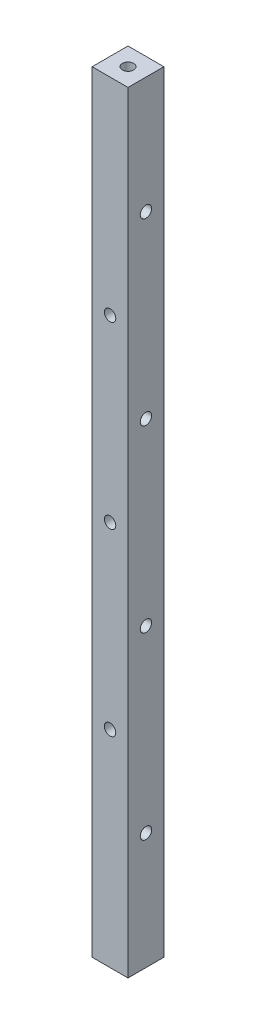
ISO-10303-21;
HEADER;
FILE_DESCRIPTION(('STEP AP214'),'2;1');
FILE_NAME('part.step','',(''),(''),'','','');
FILE_SCHEMA(('AUTOMOTIVE_DESIGN { 1 0 10303 214 1 1 1 1 }'));
ENDSEC;
DATA;
#1=APPLICATION_CONTEXT('core data for automotive mechanical design processes');
#2=APPLICATION_PROTOCOL_DEFINITION('international standard','automotive_design',2000,#1);
#3=PRODUCT_CONTEXT('',#1,'mechanical');
#4=PRODUCT('Part','Part','',(#3));
#5=PRODUCT_RELATED_PRODUCT_CATEGORY('part','',(#4));
#6=PRODUCT_DEFINITION_FORMATION('','',#4);
#7=PRODUCT_DEFINITION_CONTEXT('part definition',#1,'design');
#8=PRODUCT_DEFINITION('design','',#6,#7);
#9=PRODUCT_DEFINITION_SHAPE('','',#8);
#10=(LENGTH_UNIT() NAMED_UNIT(*) SI_UNIT(.MILLI.,.METRE.));
#11=(NAMED_UNIT(*) PLANE_ANGLE_UNIT() SI_UNIT($,.RADIAN.));
#12=(NAMED_UNIT(*) SI_UNIT($,.STERADIAN.) SOLID_ANGLE_UNIT());
#13=UNCERTAINTY_MEASURE_WITH_UNIT(LENGTH_MEASURE(1.E-05),#10,'distance_accuracy_value','');
#14=(GEOMETRIC_REPRESENTATION_CONTEXT(3) GLOBAL_UNCERTAINTY_ASSIGNED_CONTEXT((#13)) GLOBAL_UNIT_ASSIGNED_CONTEXT((#10,
#11,#12)) REPRESENTATION_CONTEXT('',''));
#15=CARTESIAN_POINT('',(0.,0.,0.));
#16=DIRECTION('',(0.,0.,1.));
#17=DIRECTION('',(1.,0.,0.));
#18=AXIS2_PLACEMENT_3D('',#15,#16,#17);
#19=CARTESIAN_POINT('',(-6.34999999999997,136.525,6.35000000000002));
#20=DIRECTION('',(1.,0.,0.));
#21=DIRECTION('',(0.,0.,-1.));
#22=AXIS2_PLACEMENT_3D('',#19,#20,#21);
#23=PLANE('',#22);
#24=CARTESIAN_POINT('',(-6.34999999999997,31.75,0.));
#25=DIRECTION('',(-1.,0.,0.));
#26=DIRECTION('',(0.,0.,1.));
#27=AXIS2_PLACEMENT_3D('',#24,#25,#26);
#28=CIRCLE('',#27,2.01929999999999);
#29=CARTESIAN_POINT('',(-6.34999999999997,31.75,2.01929999999999));
#30=VERTEX_POINT('',#29);
#31=EDGE_CURVE('E190',#30,#30,#28,.T.);
#32=ORIENTED_EDGE('',*,*,#31,.F.);
#33=EDGE_LOOP('',(#32));
#34=FACE_BOUND('',#33,.T.);
#35=CARTESIAN_POINT('',(-6.34999999999997,-31.75,0.));
#36=DIRECTION('',(-1.,0.,0.));
#37=DIRECTION('',(0.,0.,1.));
#38=AXIS2_PLACEMENT_3D('',#35,#36,#37);
#39=CIRCLE('',#38,2.01929999999999);
#40=CARTESIAN_POINT('',(-6.34999999999997,-31.75,2.01929999999999));
#41=VERTEX_POINT('',#40);
#42=EDGE_CURVE('E194',#41,#41,#39,.T.);
#43=ORIENTED_EDGE('',*,*,#42,.F.);
#44=EDGE_LOOP('',(#43));
#45=FACE_BOUND('',#44,.T.);
#46=CARTESIAN_POINT('',(-6.34999999999997,-95.25,0.));
#47=DIRECTION('',(-1.,0.,0.));
#48=DIRECTION('',(0.,0.,1.));
#49=AXIS2_PLACEMENT_3D('',#46,#47,#48);
#50=CIRCLE('',#49,2.01929999999999);
#51=CARTESIAN_POINT('',(-6.34999999999997,-95.25,2.01929999999999));
#52=VERTEX_POINT('',#51);
#53=EDGE_CURVE('E197',#52,#52,#50,.T.);
#54=ORIENTED_EDGE('',*,*,#53,.F.);
#55=EDGE_LOOP('',(#54));
#56=FACE_BOUND('',#55,.T.);
#57=DIRECTION('',(0.,0.,1.));
#58=VECTOR('',#57,1.);
#59=CARTESIAN_POINT('',(-6.34999999999997,-136.525,6.35000000000002));
#60=LINE('',#59,#58);
#61=CARTESIAN_POINT('',(-6.34999999999997,-136.525,-6.35000000000002));
#62=VERTEX_POINT('',#61);
#63=CARTESIAN_POINT('',(-6.34999999999997,-136.525,6.35000000000002));
#64=VERTEX_POINT('',#63);
#65=EDGE_CURVE('E80',#62,#64,#60,.T.);
#66=ORIENTED_EDGE('',*,*,#65,.T.);
#67=DIRECTION('',(0.,-1.,0.));
#68=VECTOR('',#67,1.);
#69=CARTESIAN_POINT('',(-6.34999999999997,136.525,6.35000000000002));
#70=LINE('',#69,#68);
#71=CARTESIAN_POINT('',(-6.34999999999997,136.525,6.35000000000002));
#72=VERTEX_POINT('',#71);
#73=EDGE_CURVE('E152',#72,#64,#70,.T.);
#74=ORIENTED_EDGE('',*,*,#73,.F.);
#75=DIRECTION('',(0.,0.,1.));
#76=VECTOR('',#75,1.);
#77=CARTESIAN_POINT('',(-6.34999999999997,136.525,6.35000000000002));
#78=LINE('',#77,#76);
#79=CARTESIAN_POINT('',(-6.34999999999997,136.525,-6.35000000000002));
#80=VERTEX_POINT('',#79);
#81=EDGE_CURVE('E134',#80,#72,#78,.T.);
#82=ORIENTED_EDGE('',*,*,#81,.F.);
#83=DIRECTION('',(0.,-1.,0.));
#84=VECTOR('',#83,1.);
#85=CARTESIAN_POINT('',(-6.34999999999997,136.525,-6.35000000000002));
#86=LINE('',#85,#84);
#87=EDGE_CURVE('E54',#80,#62,#86,.T.);
#88=ORIENTED_EDGE('',*,*,#87,.T.);
#89=EDGE_LOOP('',(#66,#74,#82,#88));
#90=FACE_BOUND('',#89,.T.);
#91=CARTESIAN_POINT('',(-6.34999999999997,95.25,0.));
#92=DIRECTION('',(-1.,0.,0.));
#93=DIRECTION('',(0.,0.,1.));
#94=AXIS2_PLACEMENT_3D('',#91,#92,#93);
#95=CIRCLE('',#94,2.01929999999999);
#96=CARTESIAN_POINT('',(-6.34999999999997,95.25,2.01929999999999));
#97=VERTEX_POINT('',#96);
#98=EDGE_CURVE('E502',#97,#97,#95,.T.);
#99=ORIENTED_EDGE('',*,*,#98,.F.);
#100=EDGE_LOOP('',(#99));
#101=FACE_BOUND('',#100,.T.);
#102=ADVANCED_FACE('F44',(#34,#45,#56,#90,#101),#23,.F.);
#103=CARTESIAN_POINT('',(6.34999999999997,136.525,6.35000000000002));
#104=DIRECTION('',(-1.,0.,0.));
#105=DIRECTION('',(0.,0.,1.));
#106=AXIS2_PLACEMENT_3D('',#103,#104,#105);
#107=PLANE('',#106);
#108=CARTESIAN_POINT('',(6.34999999999997,95.25,0.));
#109=DIRECTION('',(-1.,0.,0.));
#110=DIRECTION('',(0.,0.,1.));
#111=AXIS2_PLACEMENT_3D('',#108,#109,#110);
#112=CIRCLE('',#111,2.01929999999999);
#113=CARTESIAN_POINT('',(6.34999999999997,95.25,2.01929999999999));
#114=VERTEX_POINT('',#113);
#115=EDGE_CURVE('E498',#114,#114,#112,.T.);
#116=ORIENTED_EDGE('',*,*,#115,.T.);
#117=EDGE_LOOP('',(#116));
#118=FACE_BOUND('',#117,.T.);
#119=CARTESIAN_POINT('',(6.34999999999997,31.75,0.));
#120=DIRECTION('',(-1.,0.,0.));
#121=DIRECTION('',(0.,0.,1.));
#122=AXIS2_PLACEMENT_3D('',#119,#120,#121);
#123=CIRCLE('',#122,2.01929999999999);
#124=CARTESIAN_POINT('',(6.34999999999997,31.75,2.01929999999999));
#125=VERTEX_POINT('',#124);
#126=EDGE_CURVE('E490',#125,#125,#123,.T.);
#127=ORIENTED_EDGE('',*,*,#126,.T.);
#128=EDGE_LOOP('',(#127));
#129=FACE_BOUND('',#128,.T.);
#130=CARTESIAN_POINT('',(6.34999999999997,-31.75,0.));
#131=DIRECTION('',(-1.,0.,0.));
#132=DIRECTION('',(0.,0.,1.));
#133=AXIS2_PLACEMENT_3D('',#130,#131,#132);
#134=CIRCLE('',#133,2.01929999999999);
#135=CARTESIAN_POINT('',(6.34999999999997,-31.75,2.01929999999999));
#136=VERTEX_POINT('',#135);
#137=EDGE_CURVE('E201',#136,#136,#134,.T.);
#138=ORIENTED_EDGE('',*,*,#137,.T.);
#139=EDGE_LOOP('',(#138));
#140=FACE_BOUND('',#139,.T.);
#141=CARTESIAN_POINT('',(6.34999999999997,-95.25,0.));
#142=DIRECTION('',(-1.,0.,0.));
#143=DIRECTION('',(0.,0.,1.));
#144=AXIS2_PLACEMENT_3D('',#141,#142,#143);
#145=CIRCLE('',#144,2.01929999999999);
#146=CARTESIAN_POINT('',(6.34999999999997,-95.25,2.01929999999999));
#147=VERTEX_POINT('',#146);
#148=EDGE_CURVE('E200',#147,#147,#145,.T.);
#149=ORIENTED_EDGE('',*,*,#148,.T.);
#150=EDGE_LOOP('',(#149));
#151=FACE_BOUND('',#150,.T.);
#152=DIRECTION('',(0.,0.,-1.));
#153=VECTOR('',#152,1.);
#154=CARTESIAN_POINT('',(6.34999999999997,-136.525,6.35000000000002));
#155=LINE('',#154,#153);
#156=CARTESIAN_POINT('',(6.34999999999997,-136.525,6.35000000000002));
#157=VERTEX_POINT('',#156);
#158=CARTESIAN_POINT('',(6.34999999999997,-136.525,-6.35000000000002));
#159=VERTEX_POINT('',#158);
#160=EDGE_CURVE('E128',#157,#159,#155,.T.);
#161=ORIENTED_EDGE('',*,*,#160,.T.);
#162=DIRECTION('',(0.,-1.,0.));
#163=VECTOR('',#162,1.);
#164=CARTESIAN_POINT('',(6.34999999999997,136.525,-6.35000000000002));
#165=LINE('',#164,#163);
#166=CARTESIAN_POINT('',(6.34999999999997,136.525,-6.35000000000002));
#167=VERTEX_POINT('',#166);
#168=EDGE_CURVE('E11',#167,#159,#165,.T.);
#169=ORIENTED_EDGE('',*,*,#168,.F.);
#170=DIRECTION('',(0.,0.,-1.));
#171=VECTOR('',#170,1.);
#172=CARTESIAN_POINT('',(6.34999999999997,136.525,6.35000000000002));
#173=LINE('',#172,#171);
#174=CARTESIAN_POINT('',(6.34999999999997,136.525,6.35000000000002));
#175=VERTEX_POINT('',#174);
#176=EDGE_CURVE('E129',#175,#167,#173,.T.);
#177=ORIENTED_EDGE('',*,*,#176,.F.);
#178=DIRECTION('',(0.,-1.,0.));
#179=VECTOR('',#178,1.);
#180=CARTESIAN_POINT('',(6.34999999999997,136.525,6.35000000000002));
#181=LINE('',#180,#179);
#182=EDGE_CURVE('E139',#175,#157,#181,.T.);
#183=ORIENTED_EDGE('',*,*,#182,.T.);
#184=EDGE_LOOP('',(#161,#169,#177,#183));
#185=FACE_BOUND('',#184,.T.);
#186=ADVANCED_FACE('F46',(#118,#129,#140,#151,#185),#107,.F.);
#187=CARTESIAN_POINT('',(-6.34999999999997,136.525,-6.35000000000002));
#188=DIRECTION('',(0.,0.,1.));
#189=DIRECTION('',(1.,0.,0.));
#190=AXIS2_PLACEMENT_3D('',#187,#188,#189);
#191=PLANE('',#190);
#192=CARTESIAN_POINT('',(0.,63.5,-6.35000000000002));
#193=DIRECTION('',(0.,0.,-1.));
#194=DIRECTION('',(-1.,0.,0.));
#195=AXIS2_PLACEMENT_3D('',#192,#193,#194);
#196=CIRCLE('',#195,2.01929999999999);
#197=CARTESIAN_POINT('',(-2.01929999999999,63.5,-6.35000000000002));
#198=VERTEX_POINT('',#197);
#199=EDGE_CURVE('E207',#198,#198,#196,.T.);
#200=ORIENTED_EDGE('',*,*,#199,.F.);
#201=EDGE_LOOP('',(#200));
#202=FACE_BOUND('',#201,.T.);
#203=CARTESIAN_POINT('',(0.,0.,-6.35000000000002));
#204=DIRECTION('',(0.,0.,-1.));
#205=DIRECTION('',(-1.,0.,0.));
#206=AXIS2_PLACEMENT_3D('',#203,#204,#205);
#207=CIRCLE('',#206,2.01929999999999);
#208=CARTESIAN_POINT('',(-2.01929999999999,0.,-6.35000000000002));
#209=VERTEX_POINT('',#208);
#210=EDGE_CURVE('E219',#209,#209,#207,.T.);
#211=ORIENTED_EDGE('',*,*,#210,.F.);
#212=EDGE_LOOP('',(#211));
#213=FACE_BOUND('',#212,.T.);
#214=CARTESIAN_POINT('',(0.,-63.5,-6.35000000000002));
#215=DIRECTION('',(0.,0.,-1.));
#216=DIRECTION('',(-1.,0.,0.));
#217=AXIS2_PLACEMENT_3D('',#214,#215,#216);
#218=CIRCLE('',#217,2.01929999999999);
#219=CARTESIAN_POINT('',(-2.01929999999999,-63.5,-6.35000000000002));
#220=VERTEX_POINT('',#219);
#221=EDGE_CURVE('E227',#220,#220,#218,.T.);
#222=ORIENTED_EDGE('',*,*,#221,.F.);
#223=EDGE_LOOP('',(#222));
#224=FACE_BOUND('',#223,.T.);
#225=DIRECTION('',(-1.,0.,0.));
#226=VECTOR('',#225,1.);
#227=CARTESIAN_POINT('',(-6.34999999999997,-136.525,-6.35000000000002));
#228=LINE('',#227,#226);
#229=EDGE_CURVE('E143',#159,#62,#228,.T.);
#230=ORIENTED_EDGE('',*,*,#229,.T.);
#231=ORIENTED_EDGE('',*,*,#87,.F.);
#232=DIRECTION('',(-1.,0.,0.));
#233=VECTOR('',#232,1.);
#234=CARTESIAN_POINT('',(-6.34999999999997,136.525,-6.35000000000002));
#235=LINE('',#234,#233);
#236=EDGE_CURVE('E93',#167,#80,#235,.T.);
#237=ORIENTED_EDGE('',*,*,#236,.F.);
#238=ORIENTED_EDGE('',*,*,#168,.T.);
#239=EDGE_LOOP('',(#230,#231,#237,#238));
#240=FACE_BOUND('',#239,.T.);
#241=ADVANCED_FACE('F167',(#202,#213,#224,#240),#191,.F.);
#242=CARTESIAN_POINT('',(-6.34999999999997,136.525,6.35000000000002));
#243=DIRECTION('',(0.,0.,-1.));
#244=DIRECTION('',(-1.,0.,0.));
#245=AXIS2_PLACEMENT_3D('',#242,#243,#244);
#246=PLANE('',#245);
#247=CARTESIAN_POINT('',(0.,63.5,6.35000000000002));
#248=DIRECTION('',(0.,0.,-1.));
#249=DIRECTION('',(-1.,0.,0.));
#250=AXIS2_PLACEMENT_3D('',#247,#248,#249);
#251=CIRCLE('',#250,2.01929999999999);
#252=CARTESIAN_POINT('',(-2.01929999999999,63.5,6.35000000000002));
#253=VERTEX_POINT('',#252);
#254=EDGE_CURVE('E216',#253,#253,#251,.T.);
#255=ORIENTED_EDGE('',*,*,#254,.T.);
#256=EDGE_LOOP('',(#255));
#257=FACE_BOUND('',#256,.T.);
#258=CARTESIAN_POINT('',(0.,0.,6.35000000000002));
#259=DIRECTION('',(0.,0.,-1.));
#260=DIRECTION('',(-1.,0.,0.));
#261=AXIS2_PLACEMENT_3D('',#258,#259,#260);
#262=CIRCLE('',#261,2.01929999999999);
#263=CARTESIAN_POINT('',(-2.01929999999999,0.,6.35000000000002));
#264=VERTEX_POINT('',#263);
#265=EDGE_CURVE('E223',#264,#264,#262,.T.);
#266=ORIENTED_EDGE('',*,*,#265,.T.);
#267=EDGE_LOOP('',(#266));
#268=FACE_BOUND('',#267,.T.);
#269=CARTESIAN_POINT('',(0.,-63.5,6.35000000000002));
#270=DIRECTION('',(0.,0.,-1.));
#271=DIRECTION('',(-1.,0.,0.));
#272=AXIS2_PLACEMENT_3D('',#269,#270,#271);
#273=CIRCLE('',#272,2.01929999999999);
#274=CARTESIAN_POINT('',(-2.01929999999999,-63.5,6.35000000000002));
#275=VERTEX_POINT('',#274);
#276=EDGE_CURVE('E121',#275,#275,#273,.T.);
#277=ORIENTED_EDGE('',*,*,#276,.T.);
#278=EDGE_LOOP('',(#277));
#279=FACE_BOUND('',#278,.T.);
#280=DIRECTION('',(1.,0.,0.));
#281=VECTOR('',#280,1.);
#282=CARTESIAN_POINT('',(-6.34999999999997,-136.525,6.35000000000002));
#283=LINE('',#282,#281);
#284=EDGE_CURVE('E86',#64,#157,#283,.T.);
#285=ORIENTED_EDGE('',*,*,#284,.T.);
#286=ORIENTED_EDGE('',*,*,#182,.F.);
#287=DIRECTION('',(1.,0.,0.));
#288=VECTOR('',#287,1.);
#289=CARTESIAN_POINT('',(-6.34999999999997,136.525,6.35000000000002));
#290=LINE('',#289,#288);
#291=EDGE_CURVE('E62',#72,#175,#290,.T.);
#292=ORIENTED_EDGE('',*,*,#291,.F.);
#293=ORIENTED_EDGE('',*,*,#73,.T.);
#294=EDGE_LOOP('',(#285,#286,#292,#293));
#295=FACE_BOUND('',#294,.T.);
#296=ADVANCED_FACE('F164',(#257,#268,#279,#295),#246,.F.);
#297=CARTESIAN_POINT('',(0.,136.525,0.));
#298=DIRECTION('',(0.,-1.,0.));
#299=DIRECTION('',(0.,0.,-1.));
#300=AXIS2_PLACEMENT_3D('',#297,#298,#299);
#301=PLANE('',#300);
#302=CARTESIAN_POINT('',(0.,136.525,0.));
#303=DIRECTION('',(0.,1.,0.));
#304=DIRECTION('',(0.,0.,1.));
#305=AXIS2_PLACEMENT_3D('',#302,#303,#304);
#306=CIRCLE('',#305,2.01929999999999);
#307=CARTESIAN_POINT('',(0.,136.525,2.01929999999999));
#308=VERTEX_POINT('',#307);
#309=EDGE_CURVE('E112',#308,#308,#306,.T.);
#310=ORIENTED_EDGE('',*,*,#309,.F.);
#311=EDGE_LOOP('',(#310));
#312=FACE_BOUND('',#311,.T.);
#313=ORIENTED_EDGE('',*,*,#176,.T.);
#314=ORIENTED_EDGE('',*,*,#236,.T.);
#315=ORIENTED_EDGE('',*,*,#81,.T.);
#316=ORIENTED_EDGE('',*,*,#291,.T.);
#317=EDGE_LOOP('',(#313,#314,#315,#316));
#318=FACE_BOUND('',#317,.T.);
#319=ADVANCED_FACE('F166',(#312,#318),#301,.F.);
#320=CARTESIAN_POINT('',(0.,-136.525,0.));
#321=DIRECTION('',(0.,-1.,0.));
#322=DIRECTION('',(0.,0.,-1.));
#323=AXIS2_PLACEMENT_3D('',#320,#321,#322);
#324=PLANE('',#323);
#325=CARTESIAN_POINT('',(0.,-136.525,0.));
#326=DIRECTION('',(0.,-1.,0.));
#327=DIRECTION('',(0.,0.,-1.));
#328=AXIS2_PLACEMENT_3D('',#325,#326,#327);
#329=CIRCLE('',#328,2.01929999999999);
#330=CARTESIAN_POINT('',(0.,-136.525,-2.01929999999999));
#331=VERTEX_POINT('',#330);
#332=EDGE_CURVE('E111',#331,#331,#329,.T.);
#333=ORIENTED_EDGE('',*,*,#332,.F.);
#334=EDGE_LOOP('',(#333));
#335=FACE_BOUND('',#334,.T.);
#336=ORIENTED_EDGE('',*,*,#160,.F.);
#337=ORIENTED_EDGE('',*,*,#284,.F.);
#338=ORIENTED_EDGE('',*,*,#65,.F.);
#339=ORIENTED_EDGE('',*,*,#229,.F.);
#340=EDGE_LOOP('',(#336,#337,#338,#339));
#341=FACE_BOUND('',#340,.T.);
#342=ADVANCED_FACE('F160',(#335,#341),#324,.T.);
#343=CARTESIAN_POINT('',(0.,-124.587,0.));
#344=DIRECTION('',(0.,-1.,0.));
#345=DIRECTION('',(0.,0.,-1.));
#346=AXIS2_PLACEMENT_3D('',#343,#344,#345);
#347=CONICAL_SURFACE('',#346,2.01929999999999,1.02974425867665);
#348=CARTESIAN_POINT('',(0.,-123.373682151998,0.));
#349=VERTEX_POINT('',#348);
#350=VERTEX_LOOP('',#349);
#351=FACE_BOUND('',#350,.T.);
#352=CARTESIAN_POINT('',(0.,-124.587,0.));
#353=DIRECTION('',(0.,-1.,0.));
#354=DIRECTION('',(0.,0.,-1.));
#355=AXIS2_PLACEMENT_3D('',#352,#353,#354);
#356=CIRCLE('',#355,2.01929999999999);
#357=CARTESIAN_POINT('',(0.,-124.587,-2.01929999999999));
#358=VERTEX_POINT('',#357);
#359=EDGE_CURVE('E118',#358,#358,#356,.T.);
#360=ORIENTED_EDGE('',*,*,#359,.T.);
#361=EDGE_LOOP('',(#360));
#362=FACE_BOUND('',#361,.T.);
#363=ADVANCED_FACE('F255',(#351,#362),#347,.F.);
#364=CARTESIAN_POINT('',(0.,-136.525,0.));
#365=DIRECTION('',(0.,-1.,0.));
#366=DIRECTION('',(0.,0.,-1.));
#367=AXIS2_PLACEMENT_3D('',#364,#365,#366);
#368=CYLINDRICAL_SURFACE('',#367,2.01929999999999);
#369=ORIENTED_EDGE('',*,*,#359,.F.);
#370=EDGE_LOOP('',(#369));
#371=FACE_BOUND('',#370,.T.);
#372=ORIENTED_EDGE('',*,*,#332,.T.);
#373=EDGE_LOOP('',(#372));
#374=FACE_BOUND('',#373,.T.);
#375=ADVANCED_FACE('F104',(#371,#374),#368,.F.);
#376=CARTESIAN_POINT('',(0.,124.587,0.));
#377=DIRECTION('',(0.,1.,0.));
#378=DIRECTION('',(0.,0.,1.));
#379=AXIS2_PLACEMENT_3D('',#376,#377,#378);
#380=CONICAL_SURFACE('',#379,2.01929999999999,1.02974425867665);
#381=CARTESIAN_POINT('',(0.,123.373682151998,0.));
#382=VERTEX_POINT('',#381);
#383=VERTEX_LOOP('',#382);
#384=FACE_BOUND('',#383,.T.);
#385=CARTESIAN_POINT('',(0.,124.587,0.));
#386=DIRECTION('',(0.,1.,0.));
#387=DIRECTION('',(0.,0.,1.));
#388=AXIS2_PLACEMENT_3D('',#385,#386,#387);
#389=CIRCLE('',#388,2.01929999999999);
#390=CARTESIAN_POINT('',(0.,124.587,2.01929999999999));
#391=VERTEX_POINT('',#390);
#392=EDGE_CURVE('E108',#391,#391,#389,.T.);
#393=ORIENTED_EDGE('',*,*,#392,.T.);
#394=EDGE_LOOP('',(#393));
#395=FACE_BOUND('',#394,.T.);
#396=ADVANCED_FACE('F100',(#384,#395),#380,.F.);
#397=CARTESIAN_POINT('',(0.,136.525,0.));
#398=DIRECTION('',(0.,1.,0.));
#399=DIRECTION('',(0.,0.,1.));
#400=AXIS2_PLACEMENT_3D('',#397,#398,#399);
#401=CYLINDRICAL_SURFACE('',#400,2.01929999999999);
#402=ORIENTED_EDGE('',*,*,#392,.F.);
#403=EDGE_LOOP('',(#402));
#404=FACE_BOUND('',#403,.T.);
#405=ORIENTED_EDGE('',*,*,#309,.T.);
#406=EDGE_LOOP('',(#405));
#407=FACE_BOUND('',#406,.T.);
#408=ADVANCED_FACE('F103',(#404,#407),#401,.F.);
#409=CARTESIAN_POINT('',(0.,-63.5,-6.35000000000002));
#410=DIRECTION('',(0.,0.,-1.));
#411=DIRECTION('',(-1.,0.,0.));
#412=AXIS2_PLACEMENT_3D('',#409,#410,#411);
#413=CYLINDRICAL_SURFACE('',#412,2.01929999999999);
#414=ORIENTED_EDGE('',*,*,#276,.F.);
#415=EDGE_LOOP('',(#414));
#416=FACE_BOUND('',#415,.T.);
#417=ORIENTED_EDGE('',*,*,#221,.T.);
#418=EDGE_LOOP('',(#417));
#419=FACE_BOUND('',#418,.T.);
#420=ADVANCED_FACE('F236',(#416,#419),#413,.F.);
#421=CARTESIAN_POINT('',(0.,0.,-6.35000000000002));
#422=DIRECTION('',(0.,0.,-1.));
#423=DIRECTION('',(-1.,0.,0.));
#424=AXIS2_PLACEMENT_3D('',#421,#422,#423);
#425=CYLINDRICAL_SURFACE('',#424,2.01929999999999);
#426=ORIENTED_EDGE('',*,*,#265,.F.);
#427=EDGE_LOOP('',(#426));
#428=FACE_BOUND('',#427,.T.);
#429=ORIENTED_EDGE('',*,*,#210,.T.);
#430=EDGE_LOOP('',(#429));
#431=FACE_BOUND('',#430,.T.);
#432=ADVANCED_FACE('F239',(#428,#431),#425,.F.);
#433=CARTESIAN_POINT('',(0.,63.5,-6.35000000000002));
#434=DIRECTION('',(0.,0.,-1.));
#435=DIRECTION('',(-1.,0.,0.));
#436=AXIS2_PLACEMENT_3D('',#433,#434,#435);
#437=CYLINDRICAL_SURFACE('',#436,2.01929999999999);
#438=ORIENTED_EDGE('',*,*,#254,.F.);
#439=EDGE_LOOP('',(#438));
#440=FACE_BOUND('',#439,.T.);
#441=ORIENTED_EDGE('',*,*,#199,.T.);
#442=EDGE_LOOP('',(#441));
#443=FACE_BOUND('',#442,.T.);
#444=ADVANCED_FACE('F247',(#440,#443),#437,.F.);
#445=CARTESIAN_POINT('',(-6.34999999999997,-95.25,0.));
#446=DIRECTION('',(-1.,0.,0.));
#447=DIRECTION('',(0.,0.,1.));
#448=AXIS2_PLACEMENT_3D('',#445,#446,#447);
#449=CYLINDRICAL_SURFACE('',#448,2.01929999999999);
#450=ORIENTED_EDGE('',*,*,#148,.F.);
#451=EDGE_LOOP('',(#450));
#452=FACE_BOUND('',#451,.T.);
#453=ORIENTED_EDGE('',*,*,#53,.T.);
#454=EDGE_LOOP('',(#453));
#455=FACE_BOUND('',#454,.T.);
#456=ADVANCED_FACE('F328',(#452,#455),#449,.F.);
#457=CARTESIAN_POINT('',(-6.34999999999997,-31.75,0.));
#458=DIRECTION('',(-1.,0.,0.));
#459=DIRECTION('',(0.,0.,1.));
#460=AXIS2_PLACEMENT_3D('',#457,#458,#459);
#461=CYLINDRICAL_SURFACE('',#460,2.01929999999999);
#462=ORIENTED_EDGE('',*,*,#137,.F.);
#463=EDGE_LOOP('',(#462));
#464=FACE_BOUND('',#463,.T.);
#465=ORIENTED_EDGE('',*,*,#42,.T.);
#466=EDGE_LOOP('',(#465));
#467=FACE_BOUND('',#466,.T.);
#468=ADVANCED_FACE('F320',(#464,#467),#461,.F.);
#469=CARTESIAN_POINT('',(-6.34999999999997,31.75,0.));
#470=DIRECTION('',(-1.,0.,0.));
#471=DIRECTION('',(0.,0.,1.));
#472=AXIS2_PLACEMENT_3D('',#469,#470,#471);
#473=CYLINDRICAL_SURFACE('',#472,2.01929999999999);
#474=ORIENTED_EDGE('',*,*,#126,.F.);
#475=EDGE_LOOP('',(#474));
#476=FACE_BOUND('',#475,.T.);
#477=ORIENTED_EDGE('',*,*,#31,.T.);
#478=EDGE_LOOP('',(#477));
#479=FACE_BOUND('',#478,.T.);
#480=ADVANCED_FACE('F309',(#476,#479),#473,.F.);
#481=CARTESIAN_POINT('',(-6.34999999999997,95.25,0.));
#482=DIRECTION('',(-1.,0.,0.));
#483=DIRECTION('',(0.,0.,1.));
#484=AXIS2_PLACEMENT_3D('',#481,#482,#483);
#485=CYLINDRICAL_SURFACE('',#484,2.01929999999999);
#486=ORIENTED_EDGE('',*,*,#115,.F.);
#487=EDGE_LOOP('',(#486));
#488=FACE_BOUND('',#487,.T.);
#489=ORIENTED_EDGE('',*,*,#98,.T.);
#490=EDGE_LOOP('',(#489));
#491=FACE_BOUND('',#490,.T.);
#492=ADVANCED_FACE('F305',(#488,#491),#485,.F.);
#493=CLOSED_SHELL('',(#102,#186,#241,#296,#319,#342,#363,#375,#396,#408,#420,#432,#444,#456,
#468,#480,#492));
#494=MANIFOLD_SOLID_BREP('B2',#493);
#495=ADVANCED_BREP_SHAPE_REPRESENTATION('',(#18,#494),#14);
#496=SHAPE_DEFINITION_REPRESENTATION(#9,#495);
ENDSEC;
END-ISO-10303-21;
